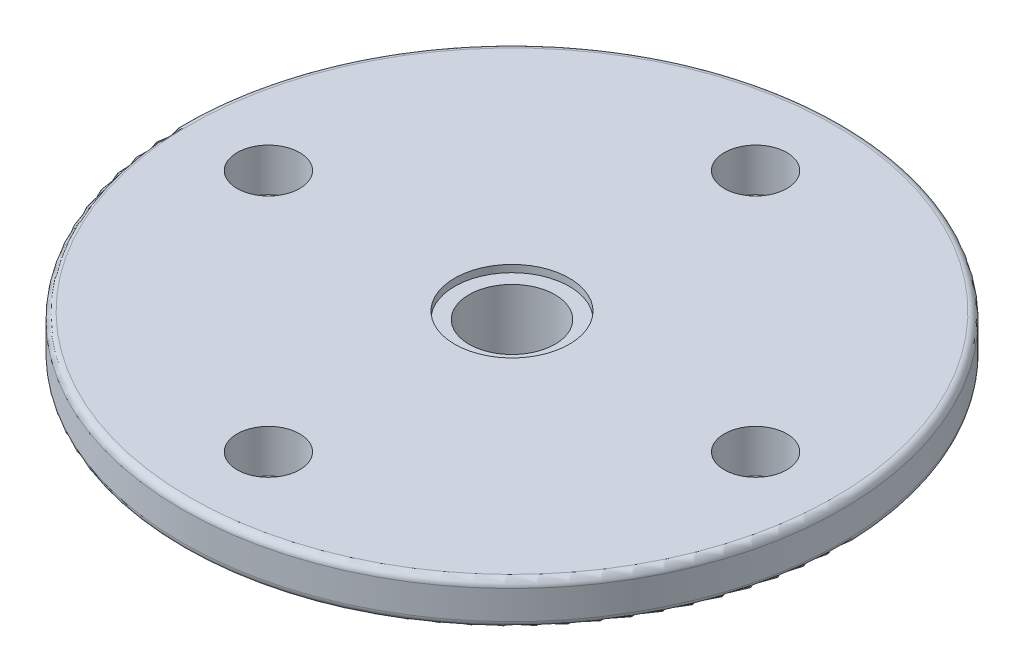
ISO-10303-21;
HEADER;
FILE_DESCRIPTION(('STEP AP214'),'2;1');
FILE_NAME('part.step','',(''),(''),'','','');
FILE_SCHEMA(('AUTOMOTIVE_DESIGN { 1 0 10303 214 1 1 1 1 }'));
ENDSEC;
DATA;
#1=APPLICATION_CONTEXT('core data for automotive mechanical design processes');
#2=APPLICATION_PROTOCOL_DEFINITION('international standard','automotive_design',2000,#1);
#3=PRODUCT_CONTEXT('',#1,'mechanical');
#4=PRODUCT('Part','Part','',(#3));
#5=PRODUCT_RELATED_PRODUCT_CATEGORY('part','',(#4));
#6=PRODUCT_DEFINITION_FORMATION('','',#4);
#7=PRODUCT_DEFINITION_CONTEXT('part definition',#1,'design');
#8=PRODUCT_DEFINITION('design','',#6,#7);
#9=PRODUCT_DEFINITION_SHAPE('','',#8);
#10=(LENGTH_UNIT() NAMED_UNIT(*) SI_UNIT(.MILLI.,.METRE.));
#11=(NAMED_UNIT(*) PLANE_ANGLE_UNIT() SI_UNIT($,.RADIAN.));
#12=(NAMED_UNIT(*) SI_UNIT($,.STERADIAN.) SOLID_ANGLE_UNIT());
#13=UNCERTAINTY_MEASURE_WITH_UNIT(LENGTH_MEASURE(1.E-05),#10,'distance_accuracy_value','');
#14=(GEOMETRIC_REPRESENTATION_CONTEXT(3) GLOBAL_UNCERTAINTY_ASSIGNED_CONTEXT((#13)) GLOBAL_UNIT_ASSIGNED_CONTEXT((#10,
#11,#12)) REPRESENTATION_CONTEXT('',''));
#15=CARTESIAN_POINT('',(0.,0.,0.));
#16=DIRECTION('',(0.,0.,1.));
#17=DIRECTION('',(1.,0.,0.));
#18=AXIS2_PLACEMENT_3D('',#15,#16,#17);
#19=CARTESIAN_POINT('',(0.,0.,0.));
#20=DIRECTION('',(0.,1.,0.));
#21=DIRECTION('',(0.,0.,1.));
#22=AXIS2_PLACEMENT_3D('',#19,#20,#21);
#23=PLANE('',#22);
#24=CARTESIAN_POINT('',(0.,0.,0.));
#25=DIRECTION('',(0.,1.,0.));
#26=DIRECTION('',(0.,0.,1.));
#27=AXIS2_PLACEMENT_3D('',#24,#25,#26);
#28=CIRCLE('',#27,11.25);
#29=CARTESIAN_POINT('',(0.,0.,11.25));
#30=VERTEX_POINT('',#29);
#31=EDGE_CURVE('E41',#30,#30,#28,.F.);
#32=ORIENTED_EDGE('',*,*,#31,.T.);
#33=EDGE_LOOP('',(#32));
#34=FACE_BOUND('',#33,.T.);
#35=CARTESIAN_POINT('',(0.,0.,-8.5));
#36=DIRECTION('',(0.,1.,0.));
#37=DIRECTION('',(0.,0.,1.));
#38=AXIS2_PLACEMENT_3D('',#35,#36,#37);
#39=CIRCLE('',#38,1.09);
#40=CARTESIAN_POINT('',(0.,0.,-7.41));
#41=VERTEX_POINT('',#40);
#42=EDGE_CURVE('E66',#41,#41,#39,.F.);
#43=ORIENTED_EDGE('',*,*,#42,.F.);
#44=EDGE_LOOP('',(#43));
#45=FACE_BOUND('',#44,.T.);
#46=CARTESIAN_POINT('',(-8.5,0.,0.));
#47=DIRECTION('',(0.,1.,0.));
#48=DIRECTION('',(1.,0.,0.));
#49=AXIS2_PLACEMENT_3D('',#46,#47,#48);
#50=CIRCLE('',#49,1.09);
#51=CARTESIAN_POINT('',(-7.41,0.,0.));
#52=VERTEX_POINT('',#51);
#53=EDGE_CURVE('E75',#52,#52,#50,.F.);
#54=ORIENTED_EDGE('',*,*,#53,.F.);
#55=EDGE_LOOP('',(#54));
#56=FACE_BOUND('',#55,.T.);
#57=CARTESIAN_POINT('',(0.,0.,8.5));
#58=DIRECTION('',(0.,1.,0.));
#59=DIRECTION('',(0.,0.,-1.));
#60=AXIS2_PLACEMENT_3D('',#57,#58,#59);
#61=CIRCLE('',#60,1.09);
#62=CARTESIAN_POINT('',(0.,0.,7.41));
#63=VERTEX_POINT('',#62);
#64=EDGE_CURVE('E81',#63,#63,#61,.F.);
#65=ORIENTED_EDGE('',*,*,#64,.F.);
#66=EDGE_LOOP('',(#65));
#67=FACE_BOUND('',#66,.T.);
#68=CARTESIAN_POINT('',(8.5,0.,0.));
#69=DIRECTION('',(0.,1.,0.));
#70=DIRECTION('',(-1.,0.,0.));
#71=AXIS2_PLACEMENT_3D('',#68,#69,#70);
#72=CIRCLE('',#71,1.09);
#73=CARTESIAN_POINT('',(7.41,0.,0.));
#74=VERTEX_POINT('',#73);
#75=EDGE_CURVE('E87',#74,#74,#72,.F.);
#76=ORIENTED_EDGE('',*,*,#75,.F.);
#77=EDGE_LOOP('',(#76));
#78=FACE_BOUND('',#77,.T.);
#79=CARTESIAN_POINT('',(0.,0.,0.));
#80=DIRECTION('',(0.,1.,0.));
#81=DIRECTION('',(0.,0.,1.));
#82=AXIS2_PLACEMENT_3D('',#79,#80,#81);
#83=CIRCLE('',#82,1.75);
#84=CARTESIAN_POINT('',(0.,0.,1.75));
#85=VERTEX_POINT('',#84);
#86=EDGE_CURVE('E54',#85,#85,#83,.F.);
#87=ORIENTED_EDGE('',*,*,#86,.F.);
#88=EDGE_LOOP('',(#87));
#89=FACE_BOUND('',#88,.T.);
#90=ADVANCED_FACE('F34',(#34,#45,#56,#67,#78,#89),#23,.F.);
#91=CARTESIAN_POINT('',(0.,1.5,0.));
#92=DIRECTION('',(0.,-1.,0.));
#93=DIRECTION('',(0.,0.,-1.));
#94=AXIS2_PLACEMENT_3D('',#91,#92,#93);
#95=CYLINDRICAL_SURFACE('',#94,1.5);
#96=CARTESIAN_POINT('',(0.,1.25,0.));
#97=DIRECTION('',(0.,1.,0.));
#98=DIRECTION('',(0.,0.,1.));
#99=AXIS2_PLACEMENT_3D('',#96,#97,#98);
#100=CIRCLE('',#99,1.5);
#101=CARTESIAN_POINT('',(0.,1.25,1.5));
#102=VERTEX_POINT('',#101);
#103=EDGE_CURVE('E61',#102,#102,#100,.T.);
#104=ORIENTED_EDGE('',*,*,#103,.T.);
#105=EDGE_LOOP('',(#104));
#106=FACE_BOUND('',#105,.T.);
#107=CARTESIAN_POINT('',(0.,-3.,0.));
#108=DIRECTION('',(0.,-1.,0.));
#109=DIRECTION('',(0.,0.,-1.));
#110=AXIS2_PLACEMENT_3D('',#107,#108,#109);
#111=CIRCLE('',#110,1.5);
#112=CARTESIAN_POINT('',(0.,-3.,-1.5));
#113=VERTEX_POINT('',#112);
#114=EDGE_CURVE('E93',#113,#113,#111,.T.);
#115=ORIENTED_EDGE('',*,*,#114,.T.);
#116=EDGE_LOOP('',(#115));
#117=FACE_BOUND('',#116,.T.);
#118=ADVANCED_FACE('F97',(#106,#117),#95,.F.);
#119=CARTESIAN_POINT('',(0.,1.5,0.));
#120=DIRECTION('',(0.,1.,0.));
#121=DIRECTION('',(0.,0.,1.));
#122=AXIS2_PLACEMENT_3D('',#119,#120,#121);
#123=PLANE('',#122);
#124=CARTESIAN_POINT('',(0.,1.5,0.));
#125=DIRECTION('',(0.,1.,0.));
#126=DIRECTION('',(0.,0.,1.));
#127=AXIS2_PLACEMENT_3D('',#124,#125,#126);
#128=CIRCLE('',#127,11.25);
#129=CARTESIAN_POINT('',(0.,1.5,11.25));
#130=VERTEX_POINT('',#129);
#131=EDGE_CURVE('E10',#130,#130,#128,.T.);
#132=ORIENTED_EDGE('',*,*,#131,.T.);
#133=EDGE_LOOP('',(#132));
#134=FACE_BOUND('',#133,.T.);
#135=CARTESIAN_POINT('',(8.5,1.5,0.));
#136=DIRECTION('',(0.,1.,0.));
#137=DIRECTION('',(-1.,0.,0.));
#138=AXIS2_PLACEMENT_3D('',#135,#136,#137);
#139=CIRCLE('',#138,1.09);
#140=CARTESIAN_POINT('',(7.41,1.5,0.));
#141=VERTEX_POINT('',#140);
#142=EDGE_CURVE('E84',#141,#141,#139,.T.);
#143=ORIENTED_EDGE('',*,*,#142,.F.);
#144=EDGE_LOOP('',(#143));
#145=FACE_BOUND('',#144,.T.);
#146=CARTESIAN_POINT('',(0.,1.5,8.5));
#147=DIRECTION('',(0.,1.,0.));
#148=DIRECTION('',(0.,0.,-1.));
#149=AXIS2_PLACEMENT_3D('',#146,#147,#148);
#150=CIRCLE('',#149,1.09);
#151=CARTESIAN_POINT('',(0.,1.5,7.41));
#152=VERTEX_POINT('',#151);
#153=EDGE_CURVE('E78',#152,#152,#150,.T.);
#154=ORIENTED_EDGE('',*,*,#153,.F.);
#155=EDGE_LOOP('',(#154));
#156=FACE_BOUND('',#155,.T.);
#157=CARTESIAN_POINT('',(-8.5,1.5,0.));
#158=DIRECTION('',(0.,1.,0.));
#159=DIRECTION('',(1.,0.,0.));
#160=AXIS2_PLACEMENT_3D('',#157,#158,#159);
#161=CIRCLE('',#160,1.09);
#162=CARTESIAN_POINT('',(-7.41,1.5,0.));
#163=VERTEX_POINT('',#162);
#164=EDGE_CURVE('E72',#163,#163,#161,.T.);
#165=ORIENTED_EDGE('',*,*,#164,.F.);
#166=EDGE_LOOP('',(#165));
#167=FACE_BOUND('',#166,.T.);
#168=CARTESIAN_POINT('',(0.,1.5,-8.5));
#169=DIRECTION('',(0.,1.,0.));
#170=DIRECTION('',(0.,0.,1.));
#171=AXIS2_PLACEMENT_3D('',#168,#169,#170);
#172=CIRCLE('',#171,1.09);
#173=CARTESIAN_POINT('',(0.,1.5,-7.41));
#174=VERTEX_POINT('',#173);
#175=EDGE_CURVE('E69',#174,#174,#172,.T.);
#176=ORIENTED_EDGE('',*,*,#175,.F.);
#177=EDGE_LOOP('',(#176));
#178=FACE_BOUND('',#177,.T.);
#179=CARTESIAN_POINT('',(0.,1.5,0.));
#180=DIRECTION('',(0.,1.,0.));
#181=DIRECTION('',(0.,0.,1.));
#182=AXIS2_PLACEMENT_3D('',#179,#180,#181);
#183=CIRCLE('',#182,2.);
#184=CARTESIAN_POINT('',(0.,1.5,2.));
#185=VERTEX_POINT('',#184);
#186=EDGE_CURVE('E58',#185,#185,#183,.T.);
#187=ORIENTED_EDGE('',*,*,#186,.F.);
#188=EDGE_LOOP('',(#187));
#189=FACE_BOUND('',#188,.T.);
#190=ADVANCED_FACE('F122',(#134,#145,#156,#167,#178,#189),#123,.T.);
#191=CARTESIAN_POINT('',(0.,1.5,0.));
#192=DIRECTION('',(0.,-1.,0.));
#193=DIRECTION('',(0.,0.,-1.));
#194=AXIS2_PLACEMENT_3D('',#191,#192,#193);
#195=CYLINDRICAL_SURFACE('',#194,11.5);
#196=CARTESIAN_POINT('',(0.,0.25,0.));
#197=DIRECTION('',(0.,1.,0.));
#198=DIRECTION('',(0.,0.,1.));
#199=AXIS2_PLACEMENT_3D('',#196,#197,#198);
#200=CIRCLE('',#199,11.5);
#201=CARTESIAN_POINT('',(0.,0.25,11.5));
#202=VERTEX_POINT('',#201);
#203=EDGE_CURVE('E45',#202,#202,#200,.T.);
#204=ORIENTED_EDGE('',*,*,#203,.T.);
#205=EDGE_LOOP('',(#204));
#206=FACE_BOUND('',#205,.T.);
#207=CARTESIAN_POINT('',(0.,1.25,0.));
#208=DIRECTION('',(0.,1.,0.));
#209=DIRECTION('',(0.,0.,1.));
#210=AXIS2_PLACEMENT_3D('',#207,#208,#209);
#211=CIRCLE('',#210,11.5);
#212=CARTESIAN_POINT('',(0.,1.25,11.5));
#213=VERTEX_POINT('',#212);
#214=EDGE_CURVE('E49',#213,#213,#211,.F.);
#215=ORIENTED_EDGE('',*,*,#214,.T.);
#216=EDGE_LOOP('',(#215));
#217=FACE_BOUND('',#216,.T.);
#218=ADVANCED_FACE('F128',(#206,#217),#195,.T.);
#219=CARTESIAN_POINT('',(0.,1.25,0.));
#220=DIRECTION('',(0.,1.,0.));
#221=DIRECTION('',(0.,0.,1.));
#222=AXIS2_PLACEMENT_3D('',#219,#220,#221);
#223=CYLINDRICAL_SURFACE('',#222,2.);
#224=CARTESIAN_POINT('',(0.,1.25,0.));
#225=DIRECTION('',(0.,1.,0.));
#226=DIRECTION('',(0.,0.,1.));
#227=AXIS2_PLACEMENT_3D('',#224,#225,#226);
#228=CIRCLE('',#227,2.);
#229=CARTESIAN_POINT('',(0.,1.25,2.));
#230=VERTEX_POINT('',#229);
#231=EDGE_CURVE('E57',#230,#230,#228,.T.);
#232=ORIENTED_EDGE('',*,*,#231,.F.);
#233=EDGE_LOOP('',(#232));
#234=FACE_BOUND('',#233,.T.);
#235=ORIENTED_EDGE('',*,*,#186,.T.);
#236=EDGE_LOOP('',(#235));
#237=FACE_BOUND('',#236,.T.);
#238=ADVANCED_FACE('F130',(#234,#237),#223,.F.);
#239=CARTESIAN_POINT('',(0.,1.25,0.));
#240=DIRECTION('',(0.,1.,0.));
#241=DIRECTION('',(0.,0.,1.));
#242=AXIS2_PLACEMENT_3D('',#239,#240,#241);
#243=PLANE('',#242);
#244=ORIENTED_EDGE('',*,*,#103,.F.);
#245=EDGE_LOOP('',(#244));
#246=FACE_BOUND('',#245,.T.);
#247=ORIENTED_EDGE('',*,*,#231,.T.);
#248=EDGE_LOOP('',(#247));
#249=FACE_BOUND('',#248,.T.);
#250=ADVANCED_FACE('F198',(#246,#249),#243,.T.);
#251=CARTESIAN_POINT('',(0.,-3.08298556597335,-8.5));
#252=DIRECTION('',(0.,1.,0.));
#253=DIRECTION('',(0.,0.,1.));
#254=AXIS2_PLACEMENT_3D('',#251,#252,#253);
#255=CYLINDRICAL_SURFACE('',#254,1.09);
#256=ORIENTED_EDGE('',*,*,#42,.T.);
#257=EDGE_LOOP('',(#256));
#258=FACE_BOUND('',#257,.T.);
#259=ORIENTED_EDGE('',*,*,#175,.T.);
#260=EDGE_LOOP('',(#259));
#261=FACE_BOUND('',#260,.T.);
#262=ADVANCED_FACE('F207',(#258,#261),#255,.F.);
#263=CARTESIAN_POINT('',(-8.5,-3.08298556597335,0.));
#264=DIRECTION('',(0.,1.,0.));
#265=DIRECTION('',(1.,0.,0.));
#266=AXIS2_PLACEMENT_3D('',#263,#264,#265);
#267=CYLINDRICAL_SURFACE('',#266,1.09);
#268=ORIENTED_EDGE('',*,*,#53,.T.);
#269=EDGE_LOOP('',(#268));
#270=FACE_BOUND('',#269,.T.);
#271=ORIENTED_EDGE('',*,*,#164,.T.);
#272=EDGE_LOOP('',(#271));
#273=FACE_BOUND('',#272,.T.);
#274=ADVANCED_FACE('F216',(#270,#273),#267,.F.);
#275=CARTESIAN_POINT('',(0.,-3.08298556597335,8.5));
#276=DIRECTION('',(0.,1.,0.));
#277=DIRECTION('',(0.,0.,-1.));
#278=AXIS2_PLACEMENT_3D('',#275,#276,#277);
#279=CYLINDRICAL_SURFACE('',#278,1.09);
#280=ORIENTED_EDGE('',*,*,#64,.T.);
#281=EDGE_LOOP('',(#280));
#282=FACE_BOUND('',#281,.T.);
#283=ORIENTED_EDGE('',*,*,#153,.T.);
#284=EDGE_LOOP('',(#283));
#285=FACE_BOUND('',#284,.T.);
#286=ADVANCED_FACE('F112',(#282,#285),#279,.F.);
#287=CARTESIAN_POINT('',(8.5,-3.08298556597335,0.));
#288=DIRECTION('',(0.,1.,0.));
#289=DIRECTION('',(-1.,0.,0.));
#290=AXIS2_PLACEMENT_3D('',#287,#288,#289);
#291=CYLINDRICAL_SURFACE('',#290,1.09);
#292=ORIENTED_EDGE('',*,*,#75,.T.);
#293=EDGE_LOOP('',(#292));
#294=FACE_BOUND('',#293,.T.);
#295=ORIENTED_EDGE('',*,*,#142,.T.);
#296=EDGE_LOOP('',(#295));
#297=FACE_BOUND('',#296,.T.);
#298=ADVANCED_FACE('F102',(#294,#297),#291,.F.);
#299=CARTESIAN_POINT('',(0.,-3.,0.));
#300=DIRECTION('',(0.,-1.,0.));
#301=DIRECTION('',(0.,0.,-1.));
#302=AXIS2_PLACEMENT_3D('',#299,#300,#301);
#303=PLANE('',#302);
#304=CARTESIAN_POINT('',(0.,-3.,0.));
#305=DIRECTION('',(0.,-1.,0.));
#306=DIRECTION('',(0.,0.,-1.));
#307=AXIS2_PLACEMENT_3D('',#304,#305,#306);
#308=CIRCLE('',#307,1.75);
#309=CARTESIAN_POINT('',(0.,-3.,-1.75));
#310=VERTEX_POINT('',#309);
#311=EDGE_CURVE('E90',#310,#310,#308,.T.);
#312=ORIENTED_EDGE('',*,*,#311,.T.);
#313=EDGE_LOOP('',(#312));
#314=FACE_BOUND('',#313,.T.);
#315=ORIENTED_EDGE('',*,*,#114,.F.);
#316=EDGE_LOOP('',(#315));
#317=FACE_BOUND('',#316,.T.);
#318=ADVANCED_FACE('F99',(#314,#317),#303,.T.);
#319=CARTESIAN_POINT('',(0.,-3.,0.));
#320=DIRECTION('',(0.,1.,0.));
#321=DIRECTION('',(0.,0.,1.));
#322=AXIS2_PLACEMENT_3D('',#319,#320,#321);
#323=CYLINDRICAL_SURFACE('',#322,1.75);
#324=ORIENTED_EDGE('',*,*,#311,.F.);
#325=EDGE_LOOP('',(#324));
#326=FACE_BOUND('',#325,.T.);
#327=ORIENTED_EDGE('',*,*,#86,.T.);
#328=EDGE_LOOP('',(#327));
#329=FACE_BOUND('',#328,.T.);
#330=ADVANCED_FACE('F101',(#326,#329),#323,.T.);
#331=CARTESIAN_POINT('',(0.,0.25,0.));
#332=DIRECTION('',(0.,1.,0.));
#333=DIRECTION('',(0.,0.,1.));
#334=AXIS2_PLACEMENT_3D('',#331,#332,#333);
#335=TOROIDAL_SURFACE('',#334,11.25,0.25);
#336=ORIENTED_EDGE('',*,*,#31,.F.);
#337=EDGE_LOOP('',(#336));
#338=FACE_BOUND('',#337,.T.);
#339=ORIENTED_EDGE('',*,*,#203,.F.);
#340=EDGE_LOOP('',(#339));
#341=FACE_BOUND('',#340,.T.);
#342=ADVANCED_FACE('F109',(#338,#341),#335,.T.);
#343=CARTESIAN_POINT('',(0.,1.25,0.));
#344=DIRECTION('',(0.,1.,0.));
#345=DIRECTION('',(0.,0.,1.));
#346=AXIS2_PLACEMENT_3D('',#343,#344,#345);
#347=TOROIDAL_SURFACE('',#346,11.25,0.25);
#348=ORIENTED_EDGE('',*,*,#214,.F.);
#349=EDGE_LOOP('',(#348));
#350=FACE_BOUND('',#349,.T.);
#351=ORIENTED_EDGE('',*,*,#131,.F.);
#352=EDGE_LOOP('',(#351));
#353=FACE_BOUND('',#352,.T.);
#354=ADVANCED_FACE('F36',(#350,#353),#347,.T.);
#355=CLOSED_SHELL('',(#90,#118,#190,#218,#238,#250,#262,#274,#286,#298,#318,#330,#342,#354));
#356=MANIFOLD_SOLID_BREP('B2',#355);
#357=ADVANCED_BREP_SHAPE_REPRESENTATION('',(#18,#356),#14);
#358=SHAPE_DEFINITION_REPRESENTATION(#9,#357);
ENDSEC;
END-ISO-10303-21;
